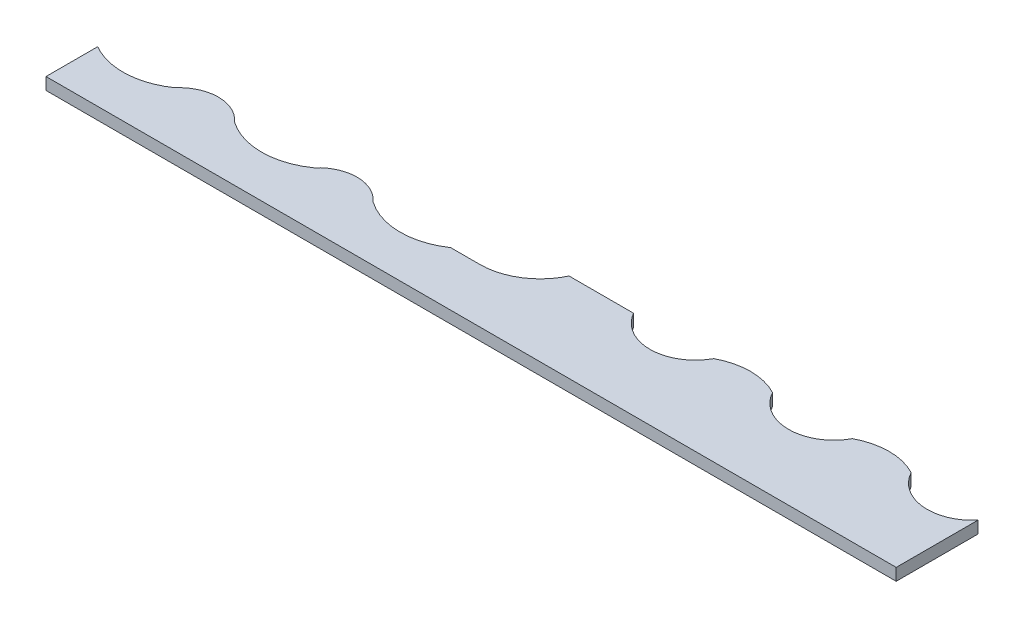
ISO-10303-21;
HEADER;
FILE_DESCRIPTION(('STEP AP214'),'2;1');
FILE_NAME('part.step','',(''),(''),'','','');
FILE_SCHEMA(('AUTOMOTIVE_DESIGN { 1 0 10303 214 1 1 1 1 }'));
ENDSEC;
DATA;
#1=APPLICATION_CONTEXT('core data for automotive mechanical design processes');
#2=APPLICATION_PROTOCOL_DEFINITION('international standard','automotive_design',2000,#1);
#3=PRODUCT_CONTEXT('',#1,'mechanical');
#4=PRODUCT('Part','Part','',(#3));
#5=PRODUCT_RELATED_PRODUCT_CATEGORY('part','',(#4));
#6=PRODUCT_DEFINITION_FORMATION('','',#4);
#7=PRODUCT_DEFINITION_CONTEXT('part definition',#1,'design');
#8=PRODUCT_DEFINITION('design','',#6,#7);
#9=PRODUCT_DEFINITION_SHAPE('','',#8);
#10=(LENGTH_UNIT() NAMED_UNIT(*) SI_UNIT(.MILLI.,.METRE.));
#11=(NAMED_UNIT(*) PLANE_ANGLE_UNIT() SI_UNIT($,.RADIAN.));
#12=(NAMED_UNIT(*) SI_UNIT($,.STERADIAN.) SOLID_ANGLE_UNIT());
#13=UNCERTAINTY_MEASURE_WITH_UNIT(LENGTH_MEASURE(1.E-05),#10,'distance_accuracy_value','');
#14=(GEOMETRIC_REPRESENTATION_CONTEXT(3) GLOBAL_UNCERTAINTY_ASSIGNED_CONTEXT((#13)) GLOBAL_UNIT_ASSIGNED_CONTEXT((#10,
#11,#12)) REPRESENTATION_CONTEXT('',''));
#15=CARTESIAN_POINT('',(0.,0.,0.));
#16=DIRECTION('',(0.,0.,1.));
#17=DIRECTION('',(1.,0.,0.));
#18=AXIS2_PLACEMENT_3D('',#15,#16,#17);
#19=CARTESIAN_POINT('',(-34.425,0.,13.5526405973202));
#20=DIRECTION('',(0.,-1.,0.));
#21=DIRECTION('',(0.,0.,-1.));
#22=AXIS2_PLACEMENT_3D('',#19,#20,#21);
#23=PLANE('',#22);
#24=DIRECTION('',(0.,0.,-1.));
#25=VECTOR('',#24,1.);
#26=CARTESIAN_POINT('',(89.1126437453176,0.,18.3749984816427));
#27=LINE('',#26,#25);
#28=CARTESIAN_POINT('',(89.1126437453176,0.,18.3749984816427));
#29=VERTEX_POINT('',#28);
#30=CARTESIAN_POINT('',(89.1126437453176,0.,4.83005634043926));
#31=VERTEX_POINT('',#30);
#32=EDGE_CURVE('E173',#29,#31,#27,.T.);
#33=ORIENTED_EDGE('',*,*,#32,.F.);
#34=DIRECTION('',(1.,0.,0.));
#35=VECTOR('',#34,1.);
#36=CARTESIAN_POINT('',(-51.6376437453177,0.,18.3749984816427));
#37=LINE('',#36,#35);
#38=CARTESIAN_POINT('',(-51.6376437453177,0.,18.3749984816427));
#39=VERTEX_POINT('',#38);
#40=EDGE_CURVE('E153',#39,#29,#37,.T.);
#41=ORIENTED_EDGE('',*,*,#40,.F.);
#42=DIRECTION('',(0.,0.,1.));
#43=VECTOR('',#42,1.);
#44=CARTESIAN_POINT('',(-51.6376437453177,0.,9.82191779907656));
#45=LINE('',#44,#43);
#46=CARTESIAN_POINT('',(-51.6376437453177,0.,9.82191779907661));
#47=VERTEX_POINT('',#46);
#48=EDGE_CURVE('E162',#47,#39,#45,.T.);
#49=ORIENTED_EDGE('',*,*,#48,.F.);
#50=CARTESIAN_POINT('',(-45.9,0.,0.));
#51=DIRECTION('',(0.,-1.,0.));
#52=DIRECTION('',(0.,0.,-1.));
#53=AXIS2_PLACEMENT_3D('',#50,#51,#52);
#54=CIRCLE('',#53,11.3750000000001);
#55=CARTESIAN_POINT('',(-39.3259829061957,0.,9.28293726416218));
#56=VERTEX_POINT('',#55);
#57=EDGE_CURVE('E180',#56,#47,#54,.T.);
#58=ORIENTED_EDGE('',*,*,#57,.F.);
#59=CARTESIAN_POINT('',(-34.425,0.,13.5526405973202));
#60=DIRECTION('',(0.,-1.,0.));
#61=DIRECTION('',(0.,0.,-1.));
#62=AXIS2_PLACEMENT_3D('',#59,#60,#61);
#63=CIRCLE('',#62,6.50000000000018);
#64=CARTESIAN_POINT('',(-29.5240170938045,0.,9.28293726416209));
#65=VERTEX_POINT('',#64);
#66=EDGE_CURVE('E182',#65,#56,#63,.F.);
#67=ORIENTED_EDGE('',*,*,#66,.F.);
#68=CARTESIAN_POINT('',(-22.95,0.,0.));
#69=DIRECTION('',(0.,-1.,0.));
#70=DIRECTION('',(0.,0.,-1.));
#71=AXIS2_PLACEMENT_3D('',#68,#69,#70);
#72=CIRCLE('',#71,11.3750000000001);
#73=CARTESIAN_POINT('',(-16.3759829061956,0.,9.28293726416217));
#74=VERTEX_POINT('',#73);
#75=EDGE_CURVE('E185',#74,#65,#72,.T.);
#76=ORIENTED_EDGE('',*,*,#75,.F.);
#77=CARTESIAN_POINT('',(-11.475,0.,13.5526405973202));
#78=DIRECTION('',(0.,-1.,0.));
#79=DIRECTION('',(0.,0.,-1.));
#80=AXIS2_PLACEMENT_3D('',#77,#78,#79);
#81=CIRCLE('',#80,6.50000000000018);
#82=CARTESIAN_POINT('',(-6.57401709380444,0.,9.28293726416204));
#83=VERTEX_POINT('',#82);
#84=EDGE_CURVE('E188',#83,#74,#81,.F.);
#85=ORIENTED_EDGE('',*,*,#84,.F.);
#86=CARTESIAN_POINT('',(0.,0.,0.));
#87=DIRECTION('',(0.,-1.,0.));
#88=DIRECTION('',(0.,0.,-1.));
#89=AXIS2_PLACEMENT_3D('',#86,#87,#88);
#90=CIRCLE('',#89,11.3750000000001);
#91=CARTESIAN_POINT('',(6.39334974890758,0.,9.40827848164283));
#92=VERTEX_POINT('',#91);
#93=EDGE_CURVE('E191',#92,#83,#90,.T.);
#94=ORIENTED_EDGE('',*,*,#93,.F.);
#95=DIRECTION('',(-1.,0.,0.));
#96=VECTOR('',#95,1.);
#97=CARTESIAN_POINT('',(20.2623562546824,0.,9.40827848164281));
#98=LINE('',#97,#96);
#99=CARTESIAN_POINT('',(11.219122853257,0.,9.40827848164282));
#100=VERTEX_POINT('',#99);
#101=EDGE_CURVE('E194',#100,#92,#98,.T.);
#102=ORIENTED_EDGE('',*,*,#101,.F.);
#103=CARTESIAN_POINT('',(11.219122853257,0.,-0.591721518357176));
#104=DIRECTION('',(0.,-1.,0.));
#105=DIRECTION('',(0.,0.,-1.));
#106=AXIS2_PLACEMENT_3D('',#103,#104,#105);
#107=CIRCLE('',#106,10.);
#108=CARTESIAN_POINT('',(20.2623562546824,0.,3.67675943478569));
#109=VERTEX_POINT('',#108);
#110=EDGE_CURVE('E11',#100,#109,#107,.F.);
#111=ORIENTED_EDGE('',*,*,#110,.T.);
#112=DIRECTION('',(-1.,0.,0.));
#113=VECTOR('',#112,1.);
#114=CARTESIAN_POINT('',(30.938071052955,0.,3.67675943478568));
#115=LINE('',#114,#113);
#116=CARTESIAN_POINT('',(30.9380710529546,0.,3.6767594347859));
#117=VERTEX_POINT('',#116);
#118=EDGE_CURVE('E196',#117,#109,#115,.T.);
#119=ORIENTED_EDGE('',*,*,#118,.F.);
#120=CARTESIAN_POINT('',(37.475,0.,0.));
#121=DIRECTION('',(0.,-1.,0.));
#122=DIRECTION('',(0.,0.,-1.));
#123=AXIS2_PLACEMENT_3D('',#120,#121,#122);
#124=CIRCLE('',#123,7.50000000000047);
#125=CARTESIAN_POINT('',(44.0848659375985,0.,3.54396279424452));
#126=VERTEX_POINT('',#125);
#127=EDGE_CURVE('E199',#126,#117,#124,.T.);
#128=ORIENTED_EDGE('',*,*,#127,.F.);
#129=CARTESIAN_POINT('',(48.95,0.,12.7075371817243));
#130=DIRECTION('',(0.,-1.,0.));
#131=DIRECTION('',(0.,0.,-1.));
#132=AXIS2_PLACEMENT_3D('',#129,#130,#131);
#133=CIRCLE('',#132,10.3750000000007);
#134=CARTESIAN_POINT('',(53.8151340624015,0.,3.54396279424452));
#135=VERTEX_POINT('',#134);
#136=EDGE_CURVE('E202',#135,#126,#133,.F.);
#137=ORIENTED_EDGE('',*,*,#136,.F.);
#138=CARTESIAN_POINT('',(60.425,0.,0.));
#139=DIRECTION('',(0.,-1.,0.));
#140=DIRECTION('',(0.,0.,-1.));
#141=AXIS2_PLACEMENT_3D('',#138,#139,#140);
#142=CIRCLE('',#141,7.50000000000091);
#143=CARTESIAN_POINT('',(67.0348659375984,0.,3.54396279424452));
#144=VERTEX_POINT('',#143);
#145=EDGE_CURVE('E205',#144,#135,#142,.T.);
#146=ORIENTED_EDGE('',*,*,#145,.F.);
#147=CARTESIAN_POINT('',(71.9,0.,12.7075371817243));
#148=DIRECTION('',(0.,-1.,0.));
#149=DIRECTION('',(0.,0.,-1.));
#150=AXIS2_PLACEMENT_3D('',#147,#148,#149);
#151=CIRCLE('',#150,10.3750000000007);
#152=CARTESIAN_POINT('',(76.7651340624019,0.,3.54396279424431));
#153=VERTEX_POINT('',#152);
#154=EDGE_CURVE('E208',#153,#144,#151,.F.);
#155=ORIENTED_EDGE('',*,*,#154,.F.);
#156=CARTESIAN_POINT('',(83.375,0.,0.));
#157=DIRECTION('',(0.,-1.,0.));
#158=DIRECTION('',(0.,0.,-1.));
#159=AXIS2_PLACEMENT_3D('',#156,#157,#158);
#160=CIRCLE('',#159,7.50000000000046);
#161=EDGE_CURVE('E175',#31,#153,#160,.T.);
#162=ORIENTED_EDGE('',*,*,#161,.F.);
#163=EDGE_LOOP('',(#33,#41,#49,#58,#67,#76,#85,#94,#102,#111,#119,#128,#137,#146,#155,#162));
#164=FACE_BOUND('',#163,.T.);
#165=ADVANCED_FACE('F39',(#164),#23,.T.);
#166=CARTESIAN_POINT('',(-51.6376437453177,-152.989340553558,18.3749984816427));
#167=DIRECTION('',(0.,0.,1.));
#168=DIRECTION('',(1.,0.,0.));
#169=AXIS2_PLACEMENT_3D('',#166,#167,#168);
#170=PLANE('',#169);
#171=ORIENTED_EDGE('',*,*,#40,.T.);
#172=DIRECTION('',(0.,1.,0.));
#173=VECTOR('',#172,1.);
#174=CARTESIAN_POINT('',(89.1126437453176,-152.989340553558,18.3749984816427));
#175=LINE('',#174,#173);
#176=CARTESIAN_POINT('',(89.1126437453176,2.,18.3749984816427));
#177=VERTEX_POINT('',#176);
#178=EDGE_CURVE('E254',#29,#177,#175,.T.);
#179=ORIENTED_EDGE('',*,*,#178,.T.);
#180=DIRECTION('',(1.,0.,0.));
#181=VECTOR('',#180,1.);
#182=CARTESIAN_POINT('',(-51.6376437453177,2.,18.3749984816427));
#183=LINE('',#182,#181);
#184=CARTESIAN_POINT('',(-51.6376437453177,2.,18.3749984816427));
#185=VERTEX_POINT('',#184);
#186=EDGE_CURVE('E156',#185,#177,#183,.T.);
#187=ORIENTED_EDGE('',*,*,#186,.F.);
#188=DIRECTION('',(0.,1.,0.));
#189=VECTOR('',#188,1.);
#190=CARTESIAN_POINT('',(-51.6376437453177,-152.989340553558,18.3749984816427));
#191=LINE('',#190,#189);
#192=EDGE_CURVE('E149',#39,#185,#191,.T.);
#193=ORIENTED_EDGE('',*,*,#192,.F.);
#194=EDGE_LOOP('',(#171,#179,#187,#193));
#195=FACE_BOUND('',#194,.T.);
#196=ADVANCED_FACE('F151',(#195),#170,.T.);
#197=CARTESIAN_POINT('',(-51.6376437453177,-152.989340553558,9.82191779907656));
#198=DIRECTION('',(-1.,0.,0.));
#199=DIRECTION('',(0.,0.,1.));
#200=AXIS2_PLACEMENT_3D('',#197,#198,#199);
#201=PLANE('',#200);
#202=ORIENTED_EDGE('',*,*,#48,.T.);
#203=ORIENTED_EDGE('',*,*,#192,.T.);
#204=DIRECTION('',(0.,0.,1.));
#205=VECTOR('',#204,1.);
#206=CARTESIAN_POINT('',(-51.6376437453177,2.,9.82191779907656));
#207=LINE('',#206,#205);
#208=CARTESIAN_POINT('',(-51.6376437453177,2.,9.82191779907661));
#209=VERTEX_POINT('',#208);
#210=EDGE_CURVE('E214',#209,#185,#207,.T.);
#211=ORIENTED_EDGE('',*,*,#210,.F.);
#212=DIRECTION('',(0.,1.,0.));
#213=VECTOR('',#212,1.);
#214=CARTESIAN_POINT('',(-51.6376437453177,-152.989340553558,9.82191779907661));
#215=LINE('',#214,#213);
#216=EDGE_CURVE('E164',#47,#209,#215,.T.);
#217=ORIENTED_EDGE('',*,*,#216,.F.);
#218=EDGE_LOOP('',(#202,#203,#211,#217));
#219=FACE_BOUND('',#218,.T.);
#220=ADVANCED_FACE('F163',(#219),#201,.T.);
#221=CARTESIAN_POINT('',(-45.9,-152.989340553558,0.));
#222=DIRECTION('',(0.,1.,0.));
#223=DIRECTION('',(0.,0.,1.));
#224=AXIS2_PLACEMENT_3D('',#221,#222,#223);
#225=CYLINDRICAL_SURFACE('',#224,11.3750000000001);
#226=ORIENTED_EDGE('',*,*,#57,.T.);
#227=ORIENTED_EDGE('',*,*,#216,.T.);
#228=CARTESIAN_POINT('',(-45.9,2.,0.));
#229=DIRECTION('',(0.,-1.,0.));
#230=DIRECTION('',(0.,0.,1.));
#231=AXIS2_PLACEMENT_3D('',#228,#229,#230);
#232=CIRCLE('',#231,11.3750000000001);
#233=CARTESIAN_POINT('',(-39.3259829061957,2.,9.28293726416218));
#234=VERTEX_POINT('',#233);
#235=EDGE_CURVE('E217',#234,#209,#232,.T.);
#236=ORIENTED_EDGE('',*,*,#235,.F.);
#237=DIRECTION('',(0.,1.,0.));
#238=VECTOR('',#237,1.);
#239=CARTESIAN_POINT('',(-39.3259829061957,-152.989340553558,9.28293726416218));
#240=LINE('',#239,#238);
#241=EDGE_CURVE('E215',#56,#234,#240,.T.);
#242=ORIENTED_EDGE('',*,*,#241,.F.);
#243=EDGE_LOOP('',(#226,#227,#236,#242));
#244=FACE_BOUND('',#243,.T.);
#245=ADVANCED_FACE('F285',(#244),#225,.F.);
#246=CARTESIAN_POINT('',(-34.425,-152.989340553558,13.5526405973202));
#247=DIRECTION('',(0.,1.,0.));
#248=DIRECTION('',(0.,0.,1.));
#249=AXIS2_PLACEMENT_3D('',#246,#247,#248);
#250=CYLINDRICAL_SURFACE('',#249,6.50000000000018);
#251=ORIENTED_EDGE('',*,*,#66,.T.);
#252=ORIENTED_EDGE('',*,*,#241,.T.);
#253=CARTESIAN_POINT('',(-34.425,2.,13.5526405973202));
#254=DIRECTION('',(0.,1.,0.));
#255=DIRECTION('',(0.,0.,1.));
#256=AXIS2_PLACEMENT_3D('',#253,#254,#255);
#257=CIRCLE('',#256,6.50000000000018);
#258=CARTESIAN_POINT('',(-29.5240170938045,2.,9.28293726416209));
#259=VERTEX_POINT('',#258);
#260=EDGE_CURVE('E220',#259,#234,#257,.T.);
#261=ORIENTED_EDGE('',*,*,#260,.F.);
#262=DIRECTION('',(0.,1.,0.));
#263=VECTOR('',#262,1.);
#264=CARTESIAN_POINT('',(-29.5240170938045,-152.989340553558,9.28293726416209));
#265=LINE('',#264,#263);
#266=EDGE_CURVE('E218',#65,#259,#265,.T.);
#267=ORIENTED_EDGE('',*,*,#266,.F.);
#268=EDGE_LOOP('',(#251,#252,#261,#267));
#269=FACE_BOUND('',#268,.T.);
#270=ADVANCED_FACE('F290',(#269),#250,.T.);
#271=CARTESIAN_POINT('',(-22.95,-152.989340553558,0.));
#272=DIRECTION('',(0.,1.,0.));
#273=DIRECTION('',(0.,0.,1.));
#274=AXIS2_PLACEMENT_3D('',#271,#272,#273);
#275=CYLINDRICAL_SURFACE('',#274,11.3750000000001);
#276=ORIENTED_EDGE('',*,*,#75,.T.);
#277=ORIENTED_EDGE('',*,*,#266,.T.);
#278=CARTESIAN_POINT('',(-22.95,2.,0.));
#279=DIRECTION('',(0.,-1.,0.));
#280=DIRECTION('',(0.,0.,1.));
#281=AXIS2_PLACEMENT_3D('',#278,#279,#280);
#282=CIRCLE('',#281,11.3750000000001);
#283=CARTESIAN_POINT('',(-16.3759829061956,2.,9.28293726416217));
#284=VERTEX_POINT('',#283);
#285=EDGE_CURVE('E223',#284,#259,#282,.T.);
#286=ORIENTED_EDGE('',*,*,#285,.F.);
#287=DIRECTION('',(0.,1.,0.));
#288=VECTOR('',#287,1.);
#289=CARTESIAN_POINT('',(-16.3759829061956,-152.989340553558,9.28293726416217));
#290=LINE('',#289,#288);
#291=EDGE_CURVE('E221',#74,#284,#290,.T.);
#292=ORIENTED_EDGE('',*,*,#291,.F.);
#293=EDGE_LOOP('',(#276,#277,#286,#292));
#294=FACE_BOUND('',#293,.T.);
#295=ADVANCED_FACE('F293',(#294),#275,.F.);
#296=CARTESIAN_POINT('',(-11.475,-152.989340553558,13.5526405973202));
#297=DIRECTION('',(0.,1.,0.));
#298=DIRECTION('',(0.,0.,1.));
#299=AXIS2_PLACEMENT_3D('',#296,#297,#298);
#300=CYLINDRICAL_SURFACE('',#299,6.50000000000018);
#301=ORIENTED_EDGE('',*,*,#84,.T.);
#302=ORIENTED_EDGE('',*,*,#291,.T.);
#303=CARTESIAN_POINT('',(-11.475,2.,13.5526405973202));
#304=DIRECTION('',(0.,1.,0.));
#305=DIRECTION('',(0.,0.,1.));
#306=AXIS2_PLACEMENT_3D('',#303,#304,#305);
#307=CIRCLE('',#306,6.50000000000018);
#308=CARTESIAN_POINT('',(-6.57401709380444,2.,9.28293726416204));
#309=VERTEX_POINT('',#308);
#310=EDGE_CURVE('E226',#309,#284,#307,.T.);
#311=ORIENTED_EDGE('',*,*,#310,.F.);
#312=DIRECTION('',(0.,1.,0.));
#313=VECTOR('',#312,1.);
#314=CARTESIAN_POINT('',(-6.57401709380444,-152.989340553558,9.28293726416204));
#315=LINE('',#314,#313);
#316=EDGE_CURVE('E224',#83,#309,#315,.T.);
#317=ORIENTED_EDGE('',*,*,#316,.F.);
#318=EDGE_LOOP('',(#301,#302,#311,#317));
#319=FACE_BOUND('',#318,.T.);
#320=ADVANCED_FACE('F296',(#319),#300,.T.);
#321=CARTESIAN_POINT('',(0.,-152.989340553558,0.));
#322=DIRECTION('',(0.,1.,0.));
#323=DIRECTION('',(0.,0.,1.));
#324=AXIS2_PLACEMENT_3D('',#321,#322,#323);
#325=CYLINDRICAL_SURFACE('',#324,11.3750000000001);
#326=ORIENTED_EDGE('',*,*,#93,.T.);
#327=ORIENTED_EDGE('',*,*,#316,.T.);
#328=CARTESIAN_POINT('',(0.,2.,0.));
#329=DIRECTION('',(0.,-1.,0.));
#330=DIRECTION('',(0.,0.,1.));
#331=AXIS2_PLACEMENT_3D('',#328,#329,#330);
#332=CIRCLE('',#331,11.3750000000001);
#333=CARTESIAN_POINT('',(6.39334974890758,2.,9.40827848164283));
#334=VERTEX_POINT('',#333);
#335=EDGE_CURVE('E230',#334,#309,#332,.T.);
#336=ORIENTED_EDGE('',*,*,#335,.F.);
#337=DIRECTION('',(0.,1.,0.));
#338=VECTOR('',#337,1.);
#339=CARTESIAN_POINT('',(6.39334974890758,-152.989340553558,9.40827848164283));
#340=LINE('',#339,#338);
#341=EDGE_CURVE('E227',#92,#334,#340,.T.);
#342=ORIENTED_EDGE('',*,*,#341,.F.);
#343=EDGE_LOOP('',(#326,#327,#336,#342));
#344=FACE_BOUND('',#343,.T.);
#345=ADVANCED_FACE('F301',(#344),#325,.F.);
#346=CARTESIAN_POINT('',(20.2623562546824,-152.989340553558,9.40827848164281));
#347=DIRECTION('',(0.,0.,-1.));
#348=DIRECTION('',(-1.,0.,0.));
#349=AXIS2_PLACEMENT_3D('',#346,#347,#348);
#350=PLANE('',#349);
#351=DIRECTION('',(-1.,0.,0.));
#352=VECTOR('',#351,1.);
#353=CARTESIAN_POINT('',(20.2623562546824,2.,9.40827848164281));
#354=LINE('',#353,#352);
#355=CARTESIAN_POINT('',(11.219122853257,2.,9.40827848164282));
#356=VERTEX_POINT('',#355);
#357=EDGE_CURVE('E235',#356,#334,#354,.T.);
#358=ORIENTED_EDGE('',*,*,#357,.F.);
#359=DIRECTION('',(0.,1.,0.));
#360=VECTOR('',#359,1.);
#361=CARTESIAN_POINT('',(11.219122853257,0.,9.40827848164282));
#362=LINE('',#361,#360);
#363=EDGE_CURVE('E60',#356,#100,#362,.F.);
#364=ORIENTED_EDGE('',*,*,#363,.T.);
#365=ORIENTED_EDGE('',*,*,#101,.T.);
#366=ORIENTED_EDGE('',*,*,#341,.T.);
#367=EDGE_LOOP('',(#358,#364,#365,#366));
#368=FACE_BOUND('',#367,.T.);
#369=ADVANCED_FACE('F303',(#368),#350,.T.);
#370=CARTESIAN_POINT('',(30.938071052955,-152.989340553558,3.67675943478568));
#371=DIRECTION('',(0.,0.,-1.));
#372=DIRECTION('',(-1.,0.,0.));
#373=AXIS2_PLACEMENT_3D('',#370,#371,#372);
#374=PLANE('',#373);
#375=ORIENTED_EDGE('',*,*,#118,.T.);
#376=DIRECTION('',(0.,1.,0.));
#377=VECTOR('',#376,1.);
#378=CARTESIAN_POINT('',(20.2623562546824,-152.989340553558,3.67675943478569));
#379=LINE('',#378,#377);
#380=CARTESIAN_POINT('',(20.2623562546824,2.,3.67675943478569));
#381=VERTEX_POINT('',#380);
#382=EDGE_CURVE('E231',#109,#381,#379,.T.);
#383=ORIENTED_EDGE('',*,*,#382,.T.);
#384=DIRECTION('',(-1.,0.,0.));
#385=VECTOR('',#384,1.);
#386=CARTESIAN_POINT('',(30.938071052955,2.,3.67675943478568));
#387=LINE('',#386,#385);
#388=CARTESIAN_POINT('',(30.9380710529546,2.,3.6767594347859));
#389=VERTEX_POINT('',#388);
#390=EDGE_CURVE('E237',#389,#381,#387,.T.);
#391=ORIENTED_EDGE('',*,*,#390,.F.);
#392=DIRECTION('',(0.,1.,0.));
#393=VECTOR('',#392,1.);
#394=CARTESIAN_POINT('',(30.9380710529546,-152.989340553558,3.6767594347859));
#395=LINE('',#394,#393);
#396=EDGE_CURVE('E234',#117,#389,#395,.T.);
#397=ORIENTED_EDGE('',*,*,#396,.F.);
#398=EDGE_LOOP('',(#375,#383,#391,#397));
#399=FACE_BOUND('',#398,.T.);
#400=ADVANCED_FACE('F309',(#399),#374,.T.);
#401=CARTESIAN_POINT('',(37.475,-152.989340553558,0.));
#402=DIRECTION('',(0.,1.,0.));
#403=DIRECTION('',(0.,0.,1.));
#404=AXIS2_PLACEMENT_3D('',#401,#402,#403);
#405=CYLINDRICAL_SURFACE('',#404,7.50000000000047);
#406=ORIENTED_EDGE('',*,*,#127,.T.);
#407=ORIENTED_EDGE('',*,*,#396,.T.);
#408=CARTESIAN_POINT('',(37.475,2.,0.));
#409=DIRECTION('',(0.,-1.,0.));
#410=DIRECTION('',(0.,0.,1.));
#411=AXIS2_PLACEMENT_3D('',#408,#409,#410);
#412=CIRCLE('',#411,7.50000000000047);
#413=CARTESIAN_POINT('',(44.0848659375985,2.,3.54396279424452));
#414=VERTEX_POINT('',#413);
#415=EDGE_CURVE('E240',#414,#389,#412,.T.);
#416=ORIENTED_EDGE('',*,*,#415,.F.);
#417=DIRECTION('',(0.,1.,0.));
#418=VECTOR('',#417,1.);
#419=CARTESIAN_POINT('',(44.0848659375985,-152.989340553558,3.54396279424452));
#420=LINE('',#419,#418);
#421=EDGE_CURVE('E238',#126,#414,#420,.T.);
#422=ORIENTED_EDGE('',*,*,#421,.F.);
#423=EDGE_LOOP('',(#406,#407,#416,#422));
#424=FACE_BOUND('',#423,.T.);
#425=ADVANCED_FACE('F313',(#424),#405,.F.);
#426=CARTESIAN_POINT('',(48.95,-152.989340553558,12.7075371817243));
#427=DIRECTION('',(0.,1.,0.));
#428=DIRECTION('',(0.,0.,1.));
#429=AXIS2_PLACEMENT_3D('',#426,#427,#428);
#430=CYLINDRICAL_SURFACE('',#429,10.3750000000007);
#431=ORIENTED_EDGE('',*,*,#136,.T.);
#432=ORIENTED_EDGE('',*,*,#421,.T.);
#433=CARTESIAN_POINT('',(48.95,2.,12.7075371817243));
#434=DIRECTION('',(0.,1.,0.));
#435=DIRECTION('',(0.,0.,1.));
#436=AXIS2_PLACEMENT_3D('',#433,#434,#435);
#437=CIRCLE('',#436,10.3750000000007);
#438=CARTESIAN_POINT('',(53.8151340624015,2.,3.54396279424452));
#439=VERTEX_POINT('',#438);
#440=EDGE_CURVE('E243',#439,#414,#437,.T.);
#441=ORIENTED_EDGE('',*,*,#440,.F.);
#442=DIRECTION('',(0.,1.,0.));
#443=VECTOR('',#442,1.);
#444=CARTESIAN_POINT('',(53.8151340624015,-152.989340553558,3.54396279424452));
#445=LINE('',#444,#443);
#446=EDGE_CURVE('E241',#135,#439,#445,.T.);
#447=ORIENTED_EDGE('',*,*,#446,.F.);
#448=EDGE_LOOP('',(#431,#432,#441,#447));
#449=FACE_BOUND('',#448,.T.);
#450=ADVANCED_FACE('F318',(#449),#430,.T.);
#451=CARTESIAN_POINT('',(60.425,-152.989340553558,0.));
#452=DIRECTION('',(0.,1.,0.));
#453=DIRECTION('',(0.,0.,1.));
#454=AXIS2_PLACEMENT_3D('',#451,#452,#453);
#455=CYLINDRICAL_SURFACE('',#454,7.50000000000091);
#456=ORIENTED_EDGE('',*,*,#145,.T.);
#457=ORIENTED_EDGE('',*,*,#446,.T.);
#458=CARTESIAN_POINT('',(60.425,2.,0.));
#459=DIRECTION('',(0.,-1.,0.));
#460=DIRECTION('',(0.,0.,1.));
#461=AXIS2_PLACEMENT_3D('',#458,#459,#460);
#462=CIRCLE('',#461,7.50000000000091);
#463=CARTESIAN_POINT('',(67.0348659375984,2.,3.54396279424452));
#464=VERTEX_POINT('',#463);
#465=EDGE_CURVE('E246',#464,#439,#462,.T.);
#466=ORIENTED_EDGE('',*,*,#465,.F.);
#467=DIRECTION('',(0.,1.,0.));
#468=VECTOR('',#467,1.);
#469=CARTESIAN_POINT('',(67.0348659375984,-152.989340553558,3.54396279424452));
#470=LINE('',#469,#468);
#471=EDGE_CURVE('E244',#144,#464,#470,.T.);
#472=ORIENTED_EDGE('',*,*,#471,.F.);
#473=EDGE_LOOP('',(#456,#457,#466,#472));
#474=FACE_BOUND('',#473,.T.);
#475=ADVANCED_FACE('F322',(#474),#455,.F.);
#476=CARTESIAN_POINT('',(71.9,-152.989340553558,12.7075371817243));
#477=DIRECTION('',(0.,1.,0.));
#478=DIRECTION('',(0.,0.,1.));
#479=AXIS2_PLACEMENT_3D('',#476,#477,#478);
#480=CYLINDRICAL_SURFACE('',#479,10.3750000000007);
#481=ORIENTED_EDGE('',*,*,#154,.T.);
#482=ORIENTED_EDGE('',*,*,#471,.T.);
#483=CARTESIAN_POINT('',(71.9,2.,12.7075371817243));
#484=DIRECTION('',(0.,1.,0.));
#485=DIRECTION('',(0.,0.,1.));
#486=AXIS2_PLACEMENT_3D('',#483,#484,#485);
#487=CIRCLE('',#486,10.3750000000007);
#488=CARTESIAN_POINT('',(76.7651340624019,2.,3.54396279424431));
#489=VERTEX_POINT('',#488);
#490=EDGE_CURVE('E249',#489,#464,#487,.T.);
#491=ORIENTED_EDGE('',*,*,#490,.F.);
#492=DIRECTION('',(0.,1.,0.));
#493=VECTOR('',#492,1.);
#494=CARTESIAN_POINT('',(76.7651340624019,-152.989340553558,3.54396279424431));
#495=LINE('',#494,#493);
#496=EDGE_CURVE('E247',#153,#489,#495,.T.);
#497=ORIENTED_EDGE('',*,*,#496,.F.);
#498=EDGE_LOOP('',(#481,#482,#491,#497));
#499=FACE_BOUND('',#498,.T.);
#500=ADVANCED_FACE('F325',(#499),#480,.T.);
#501=CARTESIAN_POINT('',(83.375,-152.989340553558,0.));
#502=DIRECTION('',(0.,1.,0.));
#503=DIRECTION('',(0.,0.,1.));
#504=AXIS2_PLACEMENT_3D('',#501,#502,#503);
#505=CYLINDRICAL_SURFACE('',#504,7.50000000000046);
#506=ORIENTED_EDGE('',*,*,#161,.T.);
#507=ORIENTED_EDGE('',*,*,#496,.T.);
#508=CARTESIAN_POINT('',(83.375,2.,0.));
#509=DIRECTION('',(0.,-1.,0.));
#510=DIRECTION('',(0.,0.,1.));
#511=AXIS2_PLACEMENT_3D('',#508,#509,#510);
#512=CIRCLE('',#511,7.50000000000046);
#513=CARTESIAN_POINT('',(89.1126437453176,2.,4.83005634043926));
#514=VERTEX_POINT('',#513);
#515=EDGE_CURVE('E253',#514,#489,#512,.T.);
#516=ORIENTED_EDGE('',*,*,#515,.F.);
#517=DIRECTION('',(0.,1.,0.));
#518=VECTOR('',#517,1.);
#519=CARTESIAN_POINT('',(89.1126437453176,-152.989340553558,4.83005634043926));
#520=LINE('',#519,#518);
#521=EDGE_CURVE('E250',#31,#514,#520,.T.);
#522=ORIENTED_EDGE('',*,*,#521,.F.);
#523=EDGE_LOOP('',(#506,#507,#516,#522));
#524=FACE_BOUND('',#523,.T.);
#525=ADVANCED_FACE('F327',(#524),#505,.F.);
#526=CARTESIAN_POINT('',(89.1126437453176,-152.989340553558,18.3749984816427));
#527=DIRECTION('',(1.,0.,0.));
#528=DIRECTION('',(0.,0.,-1.));
#529=AXIS2_PLACEMENT_3D('',#526,#527,#528);
#530=PLANE('',#529);
#531=ORIENTED_EDGE('',*,*,#32,.T.);
#532=ORIENTED_EDGE('',*,*,#521,.T.);
#533=DIRECTION('',(0.,0.,-1.));
#534=VECTOR('',#533,1.);
#535=CARTESIAN_POINT('',(89.1126437453176,2.,18.3749984816427));
#536=LINE('',#535,#534);
#537=EDGE_CURVE('E168',#177,#514,#536,.T.);
#538=ORIENTED_EDGE('',*,*,#537,.F.);
#539=ORIENTED_EDGE('',*,*,#178,.F.);
#540=EDGE_LOOP('',(#531,#532,#538,#539));
#541=FACE_BOUND('',#540,.T.);
#542=ADVANCED_FACE('F329',(#541),#530,.T.);
#543=CARTESIAN_POINT('',(-34.425,2.,13.5526405973202));
#544=DIRECTION('',(0.,-1.,0.));
#545=DIRECTION('',(0.,0.,-1.));
#546=AXIS2_PLACEMENT_3D('',#543,#544,#545);
#547=PLANE('',#546);
#548=ORIENTED_EDGE('',*,*,#186,.T.);
#549=ORIENTED_EDGE('',*,*,#537,.T.);
#550=ORIENTED_EDGE('',*,*,#515,.T.);
#551=ORIENTED_EDGE('',*,*,#490,.T.);
#552=ORIENTED_EDGE('',*,*,#465,.T.);
#553=ORIENTED_EDGE('',*,*,#440,.T.);
#554=ORIENTED_EDGE('',*,*,#415,.T.);
#555=ORIENTED_EDGE('',*,*,#390,.T.);
#556=CARTESIAN_POINT('',(11.219122853257,2.,-0.591721518357176));
#557=DIRECTION('',(0.,-1.,0.));
#558=DIRECTION('',(0.,0.,-1.));
#559=AXIS2_PLACEMENT_3D('',#556,#557,#558);
#560=CIRCLE('',#559,10.);
#561=EDGE_CURVE('E47',#381,#356,#560,.T.);
#562=ORIENTED_EDGE('',*,*,#561,.T.);
#563=ORIENTED_EDGE('',*,*,#357,.T.);
#564=ORIENTED_EDGE('',*,*,#335,.T.);
#565=ORIENTED_EDGE('',*,*,#310,.T.);
#566=ORIENTED_EDGE('',*,*,#285,.T.);
#567=ORIENTED_EDGE('',*,*,#260,.T.);
#568=ORIENTED_EDGE('',*,*,#235,.T.);
#569=ORIENTED_EDGE('',*,*,#210,.T.);
#570=EDGE_LOOP('',(#548,#549,#550,#551,#552,#553,#554,#555,#562,#563,#564,#565,#566,#567,#568,#569));
#571=FACE_BOUND('',#570,.T.);
#572=ADVANCED_FACE('F281',(#571),#547,.F.);
#573=CARTESIAN_POINT('',(11.219122853257,-152.989340553558,-0.591721518357176));
#574=DIRECTION('',(0.,-1.,0.));
#575=DIRECTION('',(0.,0.,-1.));
#576=AXIS2_PLACEMENT_3D('',#573,#574,#575);
#577=CYLINDRICAL_SURFACE('',#576,10.);
#578=ORIENTED_EDGE('',*,*,#110,.F.);
#579=ORIENTED_EDGE('',*,*,#363,.F.);
#580=ORIENTED_EDGE('',*,*,#561,.F.);
#581=ORIENTED_EDGE('',*,*,#382,.F.);
#582=EDGE_LOOP('',(#578,#579,#580,#581));
#583=FACE_BOUND('',#582,.T.);
#584=ADVANCED_FACE('F41',(#583),#577,.F.);
#585=CLOSED_SHELL('',(#165,#196,#220,#245,#270,#295,#320,#345,#369,#400,#425,#450,#475,#500,
#525,#542,#572,#584));
#586=MANIFOLD_SOLID_BREP('B2',#585);
#587=ADVANCED_BREP_SHAPE_REPRESENTATION('',(#18,#586),#14);
#588=SHAPE_DEFINITION_REPRESENTATION(#9,#587);
ENDSEC;
END-ISO-10303-21;
